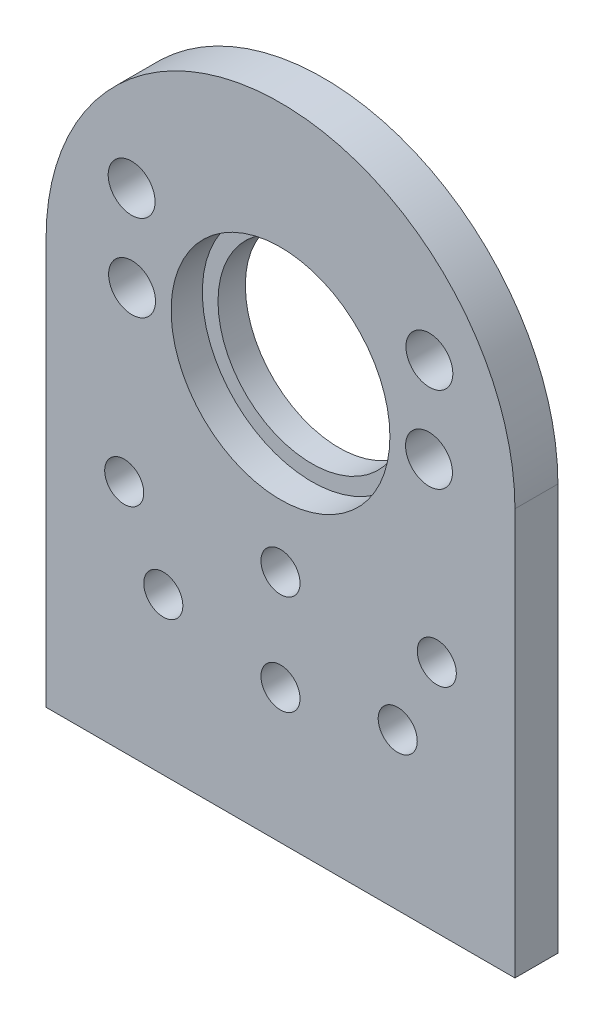
ISO-10303-21;
HEADER;
FILE_DESCRIPTION(('STEP AP214'),'2;1');
FILE_NAME('part.step','',(''),(''),'','','');
FILE_SCHEMA(('AUTOMOTIVE_DESIGN { 1 0 10303 214 1 1 1 1 }'));
ENDSEC;
DATA;
#1=APPLICATION_CONTEXT('core data for automotive mechanical design processes');
#2=APPLICATION_PROTOCOL_DEFINITION('international standard','automotive_design',2000,#1);
#3=PRODUCT_CONTEXT('',#1,'mechanical');
#4=PRODUCT('Part','Part','',(#3));
#5=PRODUCT_RELATED_PRODUCT_CATEGORY('part','',(#4));
#6=PRODUCT_DEFINITION_FORMATION('','',#4);
#7=PRODUCT_DEFINITION_CONTEXT('part definition',#1,'design');
#8=PRODUCT_DEFINITION('design','',#6,#7);
#9=PRODUCT_DEFINITION_SHAPE('','',#8);
#10=(LENGTH_UNIT() NAMED_UNIT(*) SI_UNIT(.MILLI.,.METRE.));
#11=(NAMED_UNIT(*) PLANE_ANGLE_UNIT() SI_UNIT($,.RADIAN.));
#12=(NAMED_UNIT(*) SI_UNIT($,.STERADIAN.) SOLID_ANGLE_UNIT());
#13=UNCERTAINTY_MEASURE_WITH_UNIT(LENGTH_MEASURE(1.E-05),#10,'distance_accuracy_value','');
#14=(GEOMETRIC_REPRESENTATION_CONTEXT(3) GLOBAL_UNCERTAINTY_ASSIGNED_CONTEXT((#13)) GLOBAL_UNIT_ASSIGNED_CONTEXT((#10,
#11,#12)) REPRESENTATION_CONTEXT('',''));
#15=CARTESIAN_POINT('',(0.,0.,0.));
#16=DIRECTION('',(0.,0.,1.));
#17=DIRECTION('',(1.,0.,0.));
#18=AXIS2_PLACEMENT_3D('',#15,#16,#17);
#19=CARTESIAN_POINT('',(4.89347707421227E-07,13.,3.75));
#20=DIRECTION('',(0.,0.,-1.));
#21=DIRECTION('',(-1.,0.,0.));
#22=AXIS2_PLACEMENT_3D('',#19,#20,#21);
#23=CYLINDRICAL_SURFACE('',#22,6.);
#24=CARTESIAN_POINT('',(4.89347707421227E-07,13.,0.));
#25=DIRECTION('',(0.,0.,1.));
#26=DIRECTION('',(1.,0.,0.));
#27=AXIS2_PLACEMENT_3D('',#24,#25,#26);
#28=CIRCLE('',#27,6.);
#29=CARTESIAN_POINT('',(6.00000048934771,13.,0.));
#30=VERTEX_POINT('',#29);
#31=EDGE_CURVE('E206',#30,#30,#28,.T.);
#32=ORIENTED_EDGE('',*,*,#31,.F.);
#33=EDGE_LOOP('',(#32));
#34=FACE_BOUND('',#33,.T.);
#35=CARTESIAN_POINT('',(4.89347707421227E-07,13.,1.75));
#36=DIRECTION('',(0.,0.,1.));
#37=DIRECTION('',(1.,0.,0.));
#38=AXIS2_PLACEMENT_3D('',#35,#36,#37);
#39=CIRCLE('',#38,6.);
#40=CARTESIAN_POINT('',(6.00000048934771,13.,1.75));
#41=VERTEX_POINT('',#40);
#42=EDGE_CURVE('E157',#41,#41,#39,.T.);
#43=ORIENTED_EDGE('',*,*,#42,.T.);
#44=EDGE_LOOP('',(#43));
#45=FACE_BOUND('',#44,.T.);
#46=ADVANCED_FACE('F36',(#34,#45),#23,.F.);
#47=CARTESIAN_POINT('',(4.89347707421227E-07,13.,3.75));
#48=DIRECTION('',(0.,0.,1.));
#49=DIRECTION('',(1.,0.,0.));
#50=AXIS2_PLACEMENT_3D('',#47,#48,#49);
#51=PLANE('',#50);
#52=CARTESIAN_POINT('',(-9.52627895228111,18.5,3.75));
#53=DIRECTION('',(0.,0.,1.));
#54=DIRECTION('',(1.,0.,0.));
#55=AXIS2_PLACEMENT_3D('',#52,#53,#54);
#56=CIRCLE('',#55,1.5);
#57=CARTESIAN_POINT('',(-8.02627895228111,18.5,3.75));
#58=VERTEX_POINT('',#57);
#59=EDGE_CURVE('E231',#58,#58,#56,.T.);
#60=ORIENTED_EDGE('',*,*,#59,.F.);
#61=EDGE_LOOP('',(#60));
#62=FACE_BOUND('',#61,.T.);
#63=CARTESIAN_POINT('',(9.52628034503994,18.4999992828211,3.75));
#64=DIRECTION('',(0.,0.,1.));
#65=DIRECTION('',(-1.,0.,0.));
#66=AXIS2_PLACEMENT_3D('',#63,#64,#65);
#67=CIRCLE('',#66,1.5);
#68=CARTESIAN_POINT('',(8.02628034503994,18.4999992828211,3.75));
#69=VERTEX_POINT('',#68);
#70=EDGE_CURVE('E236',#69,#69,#67,.T.);
#71=ORIENTED_EDGE('',*,*,#70,.F.);
#72=EDGE_LOOP('',(#71));
#73=FACE_BOUND('',#72,.T.);
#74=CARTESIAN_POINT('',(4.89347707421227E-07,13.,3.75));
#75=DIRECTION('',(0.,0.,1.));
#76=DIRECTION('',(1.,0.,0.));
#77=AXIS2_PLACEMENT_3D('',#74,#75,#76);
#78=CIRCLE('',#77,7.);
#79=CARTESIAN_POINT('',(7.00000048934771,13.,3.75));
#80=VERTEX_POINT('',#79);
#81=EDGE_CURVE('E153',#80,#80,#78,.T.);
#82=ORIENTED_EDGE('',*,*,#81,.F.);
#83=EDGE_LOOP('',(#82));
#84=FACE_BOUND('',#83,.T.);
#85=CARTESIAN_POINT('',(0.,2.,3.75));
#86=DIRECTION('',(0.,0.,1.));
#87=DIRECTION('',(1.,0.,0.));
#88=AXIS2_PLACEMENT_3D('',#85,#86,#87);
#89=CIRCLE('',#88,1.25);
#90=CARTESIAN_POINT('',(1.25,2.,3.75));
#91=VERTEX_POINT('',#90);
#92=EDGE_CURVE('E167',#91,#91,#89,.T.);
#93=ORIENTED_EDGE('',*,*,#92,.F.);
#94=EDGE_LOOP('',(#93));
#95=FACE_BOUND('',#94,.T.);
#96=CARTESIAN_POINT('',(10.0000004893477,2.,3.75));
#97=DIRECTION('',(0.,0.,1.));
#98=DIRECTION('',(1.,0.,0.));
#99=AXIS2_PLACEMENT_3D('',#96,#97,#98);
#100=CIRCLE('',#99,1.25);
#101=CARTESIAN_POINT('',(11.2500004893477,2.,3.75));
#102=VERTEX_POINT('',#101);
#103=EDGE_CURVE('E179',#102,#102,#100,.T.);
#104=ORIENTED_EDGE('',*,*,#103,.F.);
#105=EDGE_LOOP('',(#104));
#106=FACE_BOUND('',#105,.T.);
#107=CARTESIAN_POINT('',(7.5,-3.,3.75));
#108=DIRECTION('',(0.,0.,1.));
#109=DIRECTION('',(1.,0.,0.));
#110=AXIS2_PLACEMENT_3D('',#107,#108,#109);
#111=CIRCLE('',#110,1.25);
#112=CARTESIAN_POINT('',(8.75,-3.,3.75));
#113=VERTEX_POINT('',#112);
#114=EDGE_CURVE('E191',#113,#113,#111,.T.);
#115=ORIENTED_EDGE('',*,*,#114,.F.);
#116=EDGE_LOOP('',(#115));
#117=FACE_BOUND('',#116,.T.);
#118=CARTESIAN_POINT('',(-9.49999951065229,13.,3.75));
#119=DIRECTION('',(0.,0.,1.));
#120=DIRECTION('',(1.,0.,0.));
#121=AXIS2_PLACEMENT_3D('',#118,#119,#120);
#122=CIRCLE('',#121,1.5);
#123=CARTESIAN_POINT('',(-7.99999951065229,13.,3.75));
#124=VERTEX_POINT('',#123);
#125=EDGE_CURVE('E203',#124,#124,#122,.T.);
#126=ORIENTED_EDGE('',*,*,#125,.F.);
#127=EDGE_LOOP('',(#126));
#128=FACE_BOUND('',#127,.T.);
#129=DIRECTION('',(0.,1.,0.));
#130=VECTOR('',#129,1.);
#131=CARTESIAN_POINT('',(15.0000004893477,13.0000004241013,3.75));
#132=LINE('',#131,#130);
#133=CARTESIAN_POINT('',(15.0000004893477,-12.9999995758987,3.75));
#134=VERTEX_POINT('',#133);
#135=CARTESIAN_POINT('',(15.0000004893477,13.0000004241013,3.75));
#136=VERTEX_POINT('',#135);
#137=EDGE_CURVE('E211',#134,#136,#132,.T.);
#138=ORIENTED_EDGE('',*,*,#137,.T.);
#139=CARTESIAN_POINT('',(4.89347707421227E-07,13.,3.75));
#140=DIRECTION('',(0.,0.,1.));
#141=DIRECTION('',(1.,0.,0.));
#142=AXIS2_PLACEMENT_3D('',#139,#140,#141);
#143=CIRCLE('',#142,15.);
#144=CARTESIAN_POINT('',(-14.9999995106523,12.999998727696,3.75));
#145=VERTEX_POINT('',#144);
#146=EDGE_CURVE('E214',#136,#145,#143,.T.);
#147=ORIENTED_EDGE('',*,*,#146,.T.);
#148=DIRECTION('',(0.,-1.,0.));
#149=VECTOR('',#148,1.);
#150=CARTESIAN_POINT('',(-14.9999995106523,12.999998727696,3.75));
#151=LINE('',#150,#149);
#152=CARTESIAN_POINT('',(-14.9999995106523,-12.9999995758987,3.75));
#153=VERTEX_POINT('',#152);
#154=EDGE_CURVE('E216',#145,#153,#151,.T.);
#155=ORIENTED_EDGE('',*,*,#154,.T.);
#156=DIRECTION('',(1.,0.,0.));
#157=VECTOR('',#156,1.);
#158=CARTESIAN_POINT('',(-14.9999995106523,-12.9999995758987,3.75));
#159=LINE('',#158,#157);
#160=EDGE_CURVE('E218',#153,#134,#159,.T.);
#161=ORIENTED_EDGE('',*,*,#160,.T.);
#162=EDGE_LOOP('',(#138,#147,#155,#161));
#163=FACE_BOUND('',#162,.T.);
#164=CARTESIAN_POINT('',(9.50000048934771,13.,3.75));
#165=DIRECTION('',(0.,0.,1.));
#166=DIRECTION('',(1.,0.,0.));
#167=AXIS2_PLACEMENT_3D('',#164,#165,#166);
#168=CIRCLE('',#167,1.5);
#169=CARTESIAN_POINT('',(11.0000004893477,13.,3.75));
#170=VERTEX_POINT('',#169);
#171=EDGE_CURVE('E197',#170,#170,#168,.T.);
#172=ORIENTED_EDGE('',*,*,#171,.F.);
#173=EDGE_LOOP('',(#172));
#174=FACE_BOUND('',#173,.T.);
#175=CARTESIAN_POINT('',(-7.5,-3.,3.75));
#176=DIRECTION('',(0.,0.,1.));
#177=DIRECTION('',(1.,0.,0.));
#178=AXIS2_PLACEMENT_3D('',#175,#176,#177);
#179=CIRCLE('',#178,1.25);
#180=CARTESIAN_POINT('',(-6.25,-3.,3.75));
#181=VERTEX_POINT('',#180);
#182=EDGE_CURVE('E185',#181,#181,#179,.T.);
#183=ORIENTED_EDGE('',*,*,#182,.F.);
#184=EDGE_LOOP('',(#183));
#185=FACE_BOUND('',#184,.T.);
#186=CARTESIAN_POINT('',(-9.99999951065229,2.,3.75));
#187=DIRECTION('',(0.,0.,1.));
#188=DIRECTION('',(1.,0.,0.));
#189=AXIS2_PLACEMENT_3D('',#186,#187,#188);
#190=CIRCLE('',#189,1.25);
#191=CARTESIAN_POINT('',(-8.74999951065229,2.,3.75));
#192=VERTEX_POINT('',#191);
#193=EDGE_CURVE('E173',#192,#192,#190,.T.);
#194=ORIENTED_EDGE('',*,*,#193,.F.);
#195=EDGE_LOOP('',(#194));
#196=FACE_BOUND('',#195,.T.);
#197=CARTESIAN_POINT('',(0.,-4.4,3.75));
#198=DIRECTION('',(0.,0.,1.));
#199=DIRECTION('',(1.,0.,0.));
#200=AXIS2_PLACEMENT_3D('',#197,#198,#199);
#201=CIRCLE('',#200,1.25);
#202=CARTESIAN_POINT('',(1.24999999999999,-4.4,3.75));
#203=VERTEX_POINT('',#202);
#204=EDGE_CURVE('E160',#203,#203,#201,.T.);
#205=ORIENTED_EDGE('',*,*,#204,.F.);
#206=EDGE_LOOP('',(#205));
#207=FACE_BOUND('',#206,.T.);
#208=ADVANCED_FACE('F246',(#62,#73,#84,#95,#106,#117,#128,#163,#174,#185,#196,#207),#51,.T.);
#209=CARTESIAN_POINT('',(4.89347707421227E-07,13.,0.));
#210=DIRECTION('',(0.,0.,1.));
#211=DIRECTION('',(1.,0.,0.));
#212=AXIS2_PLACEMENT_3D('',#209,#210,#211);
#213=PLANE('',#212);
#214=CARTESIAN_POINT('',(-9.52627895228111,18.5,0.));
#215=DIRECTION('',(0.,0.,1.));
#216=DIRECTION('',(1.,0.,0.));
#217=AXIS2_PLACEMENT_3D('',#214,#215,#216);
#218=CIRCLE('',#217,1.5);
#219=CARTESIAN_POINT('',(-8.02627895228111,18.5,0.));
#220=VERTEX_POINT('',#219);
#221=EDGE_CURVE('E40',#220,#220,#218,.T.);
#222=ORIENTED_EDGE('',*,*,#221,.T.);
#223=EDGE_LOOP('',(#222));
#224=FACE_BOUND('',#223,.T.);
#225=CARTESIAN_POINT('',(9.52628034503994,18.4999992828211,0.));
#226=DIRECTION('',(0.,0.,1.));
#227=DIRECTION('',(1.,0.,0.));
#228=AXIS2_PLACEMENT_3D('',#225,#226,#227);
#229=CIRCLE('',#228,1.5);
#230=CARTESIAN_POINT('',(11.0262803450399,18.4999992828211,0.));
#231=VERTEX_POINT('',#230);
#232=EDGE_CURVE('E229',#231,#231,#229,.T.);
#233=ORIENTED_EDGE('',*,*,#232,.T.);
#234=EDGE_LOOP('',(#233));
#235=FACE_BOUND('',#234,.T.);
#236=DIRECTION('',(0.,-1.,0.));
#237=VECTOR('',#236,1.);
#238=CARTESIAN_POINT('',(-13.4999995106523,12.9999988549264,0.));
#239=LINE('',#238,#237);
#240=CARTESIAN_POINT('',(-13.4999995106523,12.9999988549264,0.));
#241=VERTEX_POINT('',#240);
#242=CARTESIAN_POINT('',(-13.4999995106523,-11.4999995758987,0.));
#243=VERTEX_POINT('',#242);
#244=EDGE_CURVE('E136',#241,#243,#239,.T.);
#245=ORIENTED_EDGE('',*,*,#244,.F.);
#246=CARTESIAN_POINT('',(4.89347707421227E-07,13.,0.));
#247=DIRECTION('',(0.,0.,1.));
#248=DIRECTION('',(1.,0.,0.));
#249=AXIS2_PLACEMENT_3D('',#246,#247,#248);
#250=CIRCLE('',#249,13.5);
#251=CARTESIAN_POINT('',(13.5000004893477,13.0000003816912,0.));
#252=VERTEX_POINT('',#251);
#253=EDGE_CURVE('E119',#252,#241,#250,.T.);
#254=ORIENTED_EDGE('',*,*,#253,.F.);
#255=DIRECTION('',(0.,1.,0.));
#256=VECTOR('',#255,1.);
#257=CARTESIAN_POINT('',(13.5000004893477,-11.4999995758987,0.));
#258=LINE('',#257,#256);
#259=CARTESIAN_POINT('',(13.5000004893477,-11.4999995758986,0.));
#260=VERTEX_POINT('',#259);
#261=EDGE_CURVE('E113',#260,#252,#258,.T.);
#262=ORIENTED_EDGE('',*,*,#261,.F.);
#263=DIRECTION('',(1.,0.,0.));
#264=VECTOR('',#263,1.);
#265=CARTESIAN_POINT('',(-13.4999995106523,-11.4999995758987,0.));
#266=LINE('',#265,#264);
#267=EDGE_CURVE('E53',#243,#260,#266,.T.);
#268=ORIENTED_EDGE('',*,*,#267,.F.);
#269=EDGE_LOOP('',(#245,#254,#262,#268));
#270=FACE_BOUND('',#269,.T.);
#271=ORIENTED_EDGE('',*,*,#31,.T.);
#272=EDGE_LOOP('',(#271));
#273=FACE_BOUND('',#272,.T.);
#274=CARTESIAN_POINT('',(-9.49999951065229,13.,0.));
#275=DIRECTION('',(0.,0.,1.));
#276=DIRECTION('',(1.,0.,0.));
#277=AXIS2_PLACEMENT_3D('',#274,#275,#276);
#278=CIRCLE('',#277,1.5);
#279=CARTESIAN_POINT('',(-7.99999951065229,13.,0.));
#280=VERTEX_POINT('',#279);
#281=EDGE_CURVE('E200',#280,#280,#278,.T.);
#282=ORIENTED_EDGE('',*,*,#281,.T.);
#283=EDGE_LOOP('',(#282));
#284=FACE_BOUND('',#283,.T.);
#285=CARTESIAN_POINT('',(9.50000048934771,13.,0.));
#286=DIRECTION('',(0.,0.,1.));
#287=DIRECTION('',(1.,0.,0.));
#288=AXIS2_PLACEMENT_3D('',#285,#286,#287);
#289=CIRCLE('',#288,1.5);
#290=CARTESIAN_POINT('',(11.0000004893477,13.,0.));
#291=VERTEX_POINT('',#290);
#292=EDGE_CURVE('E194',#291,#291,#289,.T.);
#293=ORIENTED_EDGE('',*,*,#292,.T.);
#294=EDGE_LOOP('',(#293));
#295=FACE_BOUND('',#294,.T.);
#296=CARTESIAN_POINT('',(7.5,-3.,0.));
#297=DIRECTION('',(0.,0.,1.));
#298=DIRECTION('',(1.,0.,0.));
#299=AXIS2_PLACEMENT_3D('',#296,#297,#298);
#300=CIRCLE('',#299,1.25);
#301=CARTESIAN_POINT('',(8.75,-3.,0.));
#302=VERTEX_POINT('',#301);
#303=EDGE_CURVE('E188',#302,#302,#300,.T.);
#304=ORIENTED_EDGE('',*,*,#303,.T.);
#305=EDGE_LOOP('',(#304));
#306=FACE_BOUND('',#305,.T.);
#307=CARTESIAN_POINT('',(-7.5,-3.,0.));
#308=DIRECTION('',(0.,0.,1.));
#309=DIRECTION('',(1.,0.,0.));
#310=AXIS2_PLACEMENT_3D('',#307,#308,#309);
#311=CIRCLE('',#310,1.25);
#312=CARTESIAN_POINT('',(-6.25,-3.,0.));
#313=VERTEX_POINT('',#312);
#314=EDGE_CURVE('E182',#313,#313,#311,.T.);
#315=ORIENTED_EDGE('',*,*,#314,.T.);
#316=EDGE_LOOP('',(#315));
#317=FACE_BOUND('',#316,.T.);
#318=CARTESIAN_POINT('',(10.0000004893477,2.,0.));
#319=DIRECTION('',(0.,0.,1.));
#320=DIRECTION('',(1.,0.,0.));
#321=AXIS2_PLACEMENT_3D('',#318,#319,#320);
#322=CIRCLE('',#321,1.25);
#323=CARTESIAN_POINT('',(11.2500004893477,2.,0.));
#324=VERTEX_POINT('',#323);
#325=EDGE_CURVE('E176',#324,#324,#322,.T.);
#326=ORIENTED_EDGE('',*,*,#325,.T.);
#327=EDGE_LOOP('',(#326));
#328=FACE_BOUND('',#327,.T.);
#329=CARTESIAN_POINT('',(-9.99999951065229,2.,0.));
#330=DIRECTION('',(0.,0.,1.));
#331=DIRECTION('',(1.,0.,0.));
#332=AXIS2_PLACEMENT_3D('',#329,#330,#331);
#333=CIRCLE('',#332,1.25);
#334=CARTESIAN_POINT('',(-8.74999951065229,2.,0.));
#335=VERTEX_POINT('',#334);
#336=EDGE_CURVE('E170',#335,#335,#333,.T.);
#337=ORIENTED_EDGE('',*,*,#336,.T.);
#338=EDGE_LOOP('',(#337));
#339=FACE_BOUND('',#338,.T.);
#340=CARTESIAN_POINT('',(0.,2.,0.));
#341=DIRECTION('',(0.,0.,1.));
#342=DIRECTION('',(1.,0.,0.));
#343=AXIS2_PLACEMENT_3D('',#340,#341,#342);
#344=CIRCLE('',#343,1.25);
#345=CARTESIAN_POINT('',(1.25,2.,0.));
#346=VERTEX_POINT('',#345);
#347=EDGE_CURVE('E163',#346,#346,#344,.T.);
#348=ORIENTED_EDGE('',*,*,#347,.T.);
#349=EDGE_LOOP('',(#348));
#350=FACE_BOUND('',#349,.T.);
#351=CARTESIAN_POINT('',(0.,-4.4,0.));
#352=DIRECTION('',(0.,0.,1.));
#353=DIRECTION('',(1.,0.,0.));
#354=AXIS2_PLACEMENT_3D('',#351,#352,#353);
#355=CIRCLE('',#354,1.25);
#356=CARTESIAN_POINT('',(1.24999999999999,-4.4,0.));
#357=VERTEX_POINT('',#356);
#358=EDGE_CURVE('E164',#357,#357,#355,.T.);
#359=ORIENTED_EDGE('',*,*,#358,.T.);
#360=EDGE_LOOP('',(#359));
#361=FACE_BOUND('',#360,.T.);
#362=ADVANCED_FACE('F249',(#224,#235,#270,#273,#284,#295,#306,#317,#328,#339,#350,#361),#213,.F.);
#363=CARTESIAN_POINT('',(15.0000004893477,13.0000004241013,3.75));
#364=DIRECTION('',(-1.,0.,0.));
#365=DIRECTION('',(0.,-1.,0.));
#366=AXIS2_PLACEMENT_3D('',#363,#364,#365);
#367=PLANE('',#366);
#368=DIRECTION('',(0.,0.,-1.));
#369=VECTOR('',#368,1.);
#370=CARTESIAN_POINT('',(15.0000004893477,-12.9999995758987,3.75));
#371=LINE('',#370,#369);
#372=CARTESIAN_POINT('',(15.0000004893477,-12.9999995758987,1.));
#373=VERTEX_POINT('',#372);
#374=EDGE_CURVE('E220',#134,#373,#371,.T.);
#375=ORIENTED_EDGE('',*,*,#374,.T.);
#376=DIRECTION('',(0.,1.,0.));
#377=VECTOR('',#376,1.);
#378=CARTESIAN_POINT('',(15.0000004893477,-12.9999995758987,1.));
#379=LINE('',#378,#377);
#380=CARTESIAN_POINT('',(15.0000004893477,13.0000004241013,1.));
#381=VERTEX_POINT('',#380);
#382=EDGE_CURVE('E61',#373,#381,#379,.T.);
#383=ORIENTED_EDGE('',*,*,#382,.T.);
#384=DIRECTION('',(0.,0.,-1.));
#385=VECTOR('',#384,1.);
#386=CARTESIAN_POINT('',(15.0000004893477,13.0000004241013,3.75));
#387=LINE('',#386,#385);
#388=EDGE_CURVE('E11',#136,#381,#387,.T.);
#389=ORIENTED_EDGE('',*,*,#388,.F.);
#390=ORIENTED_EDGE('',*,*,#137,.F.);
#391=EDGE_LOOP('',(#375,#383,#389,#390));
#392=FACE_BOUND('',#391,.T.);
#393=ADVANCED_FACE('F38',(#392),#367,.F.);
#394=CARTESIAN_POINT('',(4.89347707421227E-07,13.,3.75));
#395=DIRECTION('',(0.,0.,-1.));
#396=DIRECTION('',(-1.,0.,0.));
#397=AXIS2_PLACEMENT_3D('',#394,#395,#396);
#398=CYLINDRICAL_SURFACE('',#397,15.);
#399=ORIENTED_EDGE('',*,*,#388,.T.);
#400=CARTESIAN_POINT('',(4.89347707421227E-07,13.,1.));
#401=DIRECTION('',(0.,0.,1.));
#402=DIRECTION('',(1.,0.,0.));
#403=AXIS2_PLACEMENT_3D('',#400,#401,#402);
#404=CIRCLE('',#403,15.);
#405=CARTESIAN_POINT('',(-14.9999995106523,12.999998727696,1.));
#406=VERTEX_POINT('',#405);
#407=EDGE_CURVE('E147',#381,#406,#404,.T.);
#408=ORIENTED_EDGE('',*,*,#407,.T.);
#409=DIRECTION('',(0.,0.,-1.));
#410=VECTOR('',#409,1.);
#411=CARTESIAN_POINT('',(-14.9999995106523,12.999998727696,3.75));
#412=LINE('',#411,#410);
#413=EDGE_CURVE('E45',#145,#406,#412,.T.);
#414=ORIENTED_EDGE('',*,*,#413,.F.);
#415=ORIENTED_EDGE('',*,*,#146,.F.);
#416=EDGE_LOOP('',(#399,#408,#414,#415));
#417=FACE_BOUND('',#416,.T.);
#418=ADVANCED_FACE('F288',(#417),#398,.T.);
#419=CARTESIAN_POINT('',(-14.9999995106523,12.999998727696,3.75));
#420=DIRECTION('',(1.,0.,0.));
#421=DIRECTION('',(0.,0.,-1.));
#422=AXIS2_PLACEMENT_3D('',#419,#420,#421);
#423=PLANE('',#422);
#424=ORIENTED_EDGE('',*,*,#413,.T.);
#425=DIRECTION('',(0.,-1.,0.));
#426=VECTOR('',#425,1.);
#427=CARTESIAN_POINT('',(-14.9999995106523,12.999998727696,1.));
#428=LINE('',#427,#426);
#429=CARTESIAN_POINT('',(-14.9999995106523,-12.9999995758987,1.));
#430=VERTEX_POINT('',#429);
#431=EDGE_CURVE('E150',#406,#430,#428,.T.);
#432=ORIENTED_EDGE('',*,*,#431,.T.);
#433=DIRECTION('',(0.,0.,-1.));
#434=VECTOR('',#433,1.);
#435=CARTESIAN_POINT('',(-14.9999995106523,-12.9999995758987,3.75));
#436=LINE('',#435,#434);
#437=EDGE_CURVE('E223',#153,#430,#436,.T.);
#438=ORIENTED_EDGE('',*,*,#437,.F.);
#439=ORIENTED_EDGE('',*,*,#154,.F.);
#440=EDGE_LOOP('',(#424,#432,#438,#439));
#441=FACE_BOUND('',#440,.T.);
#442=ADVANCED_FACE('F426',(#441),#423,.F.);
#443=CARTESIAN_POINT('',(-14.9999995106523,-12.9999995758987,3.75));
#444=DIRECTION('',(0.,1.,0.));
#445=DIRECTION('',(0.,0.,1.));
#446=AXIS2_PLACEMENT_3D('',#443,#444,#445);
#447=PLANE('',#446);
#448=ORIENTED_EDGE('',*,*,#437,.T.);
#449=DIRECTION('',(1.,0.,0.));
#450=VECTOR('',#449,1.);
#451=CARTESIAN_POINT('',(-14.9999995106523,-12.9999995758987,1.));
#452=LINE('',#451,#450);
#453=EDGE_CURVE('E123',#430,#373,#452,.T.);
#454=ORIENTED_EDGE('',*,*,#453,.T.);
#455=ORIENTED_EDGE('',*,*,#374,.F.);
#456=ORIENTED_EDGE('',*,*,#160,.F.);
#457=EDGE_LOOP('',(#448,#454,#455,#456));
#458=FACE_BOUND('',#457,.T.);
#459=ADVANCED_FACE('F304',(#458),#447,.F.);
#460=CARTESIAN_POINT('',(-9.49999951065229,13.,3.75));
#461=DIRECTION('',(0.,0.,-1.));
#462=DIRECTION('',(-1.,0.,0.));
#463=AXIS2_PLACEMENT_3D('',#460,#461,#462);
#464=CYLINDRICAL_SURFACE('',#463,1.5);
#465=ORIENTED_EDGE('',*,*,#125,.T.);
#466=EDGE_LOOP('',(#465));
#467=FACE_BOUND('',#466,.T.);
#468=ORIENTED_EDGE('',*,*,#281,.F.);
#469=EDGE_LOOP('',(#468));
#470=FACE_BOUND('',#469,.T.);
#471=ADVANCED_FACE('F300',(#467,#470),#464,.F.);
#472=CARTESIAN_POINT('',(9.50000048934771,13.,3.75));
#473=DIRECTION('',(0.,0.,-1.));
#474=DIRECTION('',(-1.,0.,0.));
#475=AXIS2_PLACEMENT_3D('',#472,#473,#474);
#476=CYLINDRICAL_SURFACE('',#475,1.5);
#477=ORIENTED_EDGE('',*,*,#171,.T.);
#478=EDGE_LOOP('',(#477));
#479=FACE_BOUND('',#478,.T.);
#480=ORIENTED_EDGE('',*,*,#292,.F.);
#481=EDGE_LOOP('',(#480));
#482=FACE_BOUND('',#481,.T.);
#483=ADVANCED_FACE('F303',(#479,#482),#476,.F.);
#484=CARTESIAN_POINT('',(7.5,-3.,3.75));
#485=DIRECTION('',(0.,0.,-1.));
#486=DIRECTION('',(-1.,0.,0.));
#487=AXIS2_PLACEMENT_3D('',#484,#485,#486);
#488=CYLINDRICAL_SURFACE('',#487,1.25);
#489=ORIENTED_EDGE('',*,*,#114,.T.);
#490=EDGE_LOOP('',(#489));
#491=FACE_BOUND('',#490,.T.);
#492=ORIENTED_EDGE('',*,*,#303,.F.);
#493=EDGE_LOOP('',(#492));
#494=FACE_BOUND('',#493,.T.);
#495=ADVANCED_FACE('F308',(#491,#494),#488,.F.);
#496=CARTESIAN_POINT('',(-7.5,-3.,3.75));
#497=DIRECTION('',(0.,0.,-1.));
#498=DIRECTION('',(-1.,0.,0.));
#499=AXIS2_PLACEMENT_3D('',#496,#497,#498);
#500=CYLINDRICAL_SURFACE('',#499,1.25);
#501=ORIENTED_EDGE('',*,*,#182,.T.);
#502=EDGE_LOOP('',(#501));
#503=FACE_BOUND('',#502,.T.);
#504=ORIENTED_EDGE('',*,*,#314,.F.);
#505=EDGE_LOOP('',(#504));
#506=FACE_BOUND('',#505,.T.);
#507=ADVANCED_FACE('F312',(#503,#506),#500,.F.);
#508=CARTESIAN_POINT('',(10.0000004893477,2.,3.75));
#509=DIRECTION('',(0.,0.,-1.));
#510=DIRECTION('',(-1.,0.,0.));
#511=AXIS2_PLACEMENT_3D('',#508,#509,#510);
#512=CYLINDRICAL_SURFACE('',#511,1.25);
#513=ORIENTED_EDGE('',*,*,#103,.T.);
#514=EDGE_LOOP('',(#513));
#515=FACE_BOUND('',#514,.T.);
#516=ORIENTED_EDGE('',*,*,#325,.F.);
#517=EDGE_LOOP('',(#516));
#518=FACE_BOUND('',#517,.T.);
#519=ADVANCED_FACE('F316',(#515,#518),#512,.F.);
#520=CARTESIAN_POINT('',(-9.99999951065229,2.,3.75));
#521=DIRECTION('',(0.,0.,-1.));
#522=DIRECTION('',(-1.,0.,0.));
#523=AXIS2_PLACEMENT_3D('',#520,#521,#522);
#524=CYLINDRICAL_SURFACE('',#523,1.25);
#525=ORIENTED_EDGE('',*,*,#193,.T.);
#526=EDGE_LOOP('',(#525));
#527=FACE_BOUND('',#526,.T.);
#528=ORIENTED_EDGE('',*,*,#336,.F.);
#529=EDGE_LOOP('',(#528));
#530=FACE_BOUND('',#529,.T.);
#531=ADVANCED_FACE('F320',(#527,#530),#524,.F.);
#532=CARTESIAN_POINT('',(0.,2.,3.75));
#533=DIRECTION('',(0.,0.,-1.));
#534=DIRECTION('',(-1.,0.,0.));
#535=AXIS2_PLACEMENT_3D('',#532,#533,#534);
#536=CYLINDRICAL_SURFACE('',#535,1.25);
#537=ORIENTED_EDGE('',*,*,#92,.T.);
#538=EDGE_LOOP('',(#537));
#539=FACE_BOUND('',#538,.T.);
#540=ORIENTED_EDGE('',*,*,#347,.F.);
#541=EDGE_LOOP('',(#540));
#542=FACE_BOUND('',#541,.T.);
#543=ADVANCED_FACE('F277',(#539,#542),#536,.F.);
#544=CARTESIAN_POINT('',(0.,-4.4,3.75));
#545=DIRECTION('',(0.,0.,-1.));
#546=DIRECTION('',(-1.,0.,0.));
#547=AXIS2_PLACEMENT_3D('',#544,#545,#546);
#548=CYLINDRICAL_SURFACE('',#547,1.25);
#549=ORIENTED_EDGE('',*,*,#204,.T.);
#550=EDGE_LOOP('',(#549));
#551=FACE_BOUND('',#550,.T.);
#552=ORIENTED_EDGE('',*,*,#358,.F.);
#553=EDGE_LOOP('',(#552));
#554=FACE_BOUND('',#553,.T.);
#555=ADVANCED_FACE('F273',(#551,#554),#548,.F.);
#556=CARTESIAN_POINT('',(4.89347707421227E-07,13.,1.75));
#557=DIRECTION('',(0.,0.,1.));
#558=DIRECTION('',(1.,0.,0.));
#559=AXIS2_PLACEMENT_3D('',#556,#557,#558);
#560=CYLINDRICAL_SURFACE('',#559,7.);
#561=CARTESIAN_POINT('',(4.89347707421227E-07,13.,1.75));
#562=DIRECTION('',(0.,0.,1.));
#563=DIRECTION('',(1.,0.,0.));
#564=AXIS2_PLACEMENT_3D('',#561,#562,#563);
#565=CIRCLE('',#564,7.);
#566=CARTESIAN_POINT('',(7.00000048934771,13.,1.75));
#567=VERTEX_POINT('',#566);
#568=EDGE_CURVE('E154',#567,#567,#565,.T.);
#569=ORIENTED_EDGE('',*,*,#568,.F.);
#570=EDGE_LOOP('',(#569));
#571=FACE_BOUND('',#570,.T.);
#572=ORIENTED_EDGE('',*,*,#81,.T.);
#573=EDGE_LOOP('',(#572));
#574=FACE_BOUND('',#573,.T.);
#575=ADVANCED_FACE('F276',(#571,#574),#560,.F.);
#576=CARTESIAN_POINT('',(4.89347707421227E-07,13.,1.75));
#577=DIRECTION('',(0.,0.,1.));
#578=DIRECTION('',(1.,0.,0.));
#579=AXIS2_PLACEMENT_3D('',#576,#577,#578);
#580=PLANE('',#579);
#581=ORIENTED_EDGE('',*,*,#42,.F.);
#582=EDGE_LOOP('',(#581));
#583=FACE_BOUND('',#582,.T.);
#584=ORIENTED_EDGE('',*,*,#568,.T.);
#585=EDGE_LOOP('',(#584));
#586=FACE_BOUND('',#585,.T.);
#587=ADVANCED_FACE('F330',(#583,#586),#580,.T.);
#588=CARTESIAN_POINT('',(4.89347707421227E-07,13.,1.));
#589=DIRECTION('',(0.,0.,1.));
#590=DIRECTION('',(1.,0.,0.));
#591=AXIS2_PLACEMENT_3D('',#588,#589,#590);
#592=PLANE('',#591);
#593=ORIENTED_EDGE('',*,*,#453,.F.);
#594=ORIENTED_EDGE('',*,*,#431,.F.);
#595=ORIENTED_EDGE('',*,*,#407,.F.);
#596=ORIENTED_EDGE('',*,*,#382,.F.);
#597=EDGE_LOOP('',(#593,#594,#595,#596));
#598=FACE_BOUND('',#597,.T.);
#599=DIRECTION('',(0.,-1.,0.));
#600=VECTOR('',#599,1.);
#601=CARTESIAN_POINT('',(-13.4999995106523,12.9999988549264,1.));
#602=LINE('',#601,#600);
#603=CARTESIAN_POINT('',(-13.4999995106523,12.9999988549264,1.));
#604=VERTEX_POINT('',#603);
#605=CARTESIAN_POINT('',(-13.4999995106523,-11.4999995758987,1.));
#606=VERTEX_POINT('',#605);
#607=EDGE_CURVE('E107',#604,#606,#602,.T.);
#608=ORIENTED_EDGE('',*,*,#607,.T.);
#609=DIRECTION('',(1.,0.,0.));
#610=VECTOR('',#609,1.);
#611=CARTESIAN_POINT('',(-13.4999995106523,-11.4999995758987,1.));
#612=LINE('',#611,#610);
#613=CARTESIAN_POINT('',(13.5000004893477,-11.4999995758986,1.));
#614=VERTEX_POINT('',#613);
#615=EDGE_CURVE('E128',#606,#614,#612,.T.);
#616=ORIENTED_EDGE('',*,*,#615,.T.);
#617=DIRECTION('',(0.,1.,0.));
#618=VECTOR('',#617,1.);
#619=CARTESIAN_POINT('',(13.5000004893477,-11.4999995758987,1.));
#620=LINE('',#619,#618);
#621=CARTESIAN_POINT('',(13.5000004893477,13.0000003816912,1.));
#622=VERTEX_POINT('',#621);
#623=EDGE_CURVE('E110',#614,#622,#620,.T.);
#624=ORIENTED_EDGE('',*,*,#623,.T.);
#625=CARTESIAN_POINT('',(4.89347707421227E-07,13.,1.));
#626=DIRECTION('',(0.,0.,1.));
#627=DIRECTION('',(1.,0.,0.));
#628=AXIS2_PLACEMENT_3D('',#625,#626,#627);
#629=CIRCLE('',#628,13.5);
#630=EDGE_CURVE('E102',#622,#604,#629,.T.);
#631=ORIENTED_EDGE('',*,*,#630,.T.);
#632=EDGE_LOOP('',(#608,#616,#624,#631));
#633=FACE_BOUND('',#632,.T.);
#634=ADVANCED_FACE('F104',(#598,#633),#592,.F.);
#635=CARTESIAN_POINT('',(4.89347707421227E-07,13.,1.));
#636=DIRECTION('',(0.,0.,-1.));
#637=DIRECTION('',(-1.,0.,0.));
#638=AXIS2_PLACEMENT_3D('',#635,#636,#637);
#639=CYLINDRICAL_SURFACE('',#638,13.5);
#640=ORIENTED_EDGE('',*,*,#253,.T.);
#641=DIRECTION('',(0.,0.,-1.));
#642=VECTOR('',#641,1.);
#643=CARTESIAN_POINT('',(-13.4999995106523,12.9999988549264,1.));
#644=LINE('',#643,#642);
#645=EDGE_CURVE('E116',#604,#241,#644,.T.);
#646=ORIENTED_EDGE('',*,*,#645,.F.);
#647=ORIENTED_EDGE('',*,*,#630,.F.);
#648=DIRECTION('',(0.,0.,-1.));
#649=VECTOR('',#648,1.);
#650=CARTESIAN_POINT('',(13.5000004893477,13.0000003816912,1.));
#651=LINE('',#650,#649);
#652=EDGE_CURVE('E134',#622,#252,#651,.T.);
#653=ORIENTED_EDGE('',*,*,#652,.T.);
#654=EDGE_LOOP('',(#640,#646,#647,#653));
#655=FACE_BOUND('',#654,.T.);
#656=ADVANCED_FACE('F117',(#655),#639,.T.);
#657=CARTESIAN_POINT('',(-13.4999995106523,12.9999988549264,1.));
#658=DIRECTION('',(1.,0.,0.));
#659=DIRECTION('',(0.,1.,0.));
#660=AXIS2_PLACEMENT_3D('',#657,#658,#659);
#661=PLANE('',#660);
#662=ORIENTED_EDGE('',*,*,#244,.T.);
#663=DIRECTION('',(0.,0.,-1.));
#664=VECTOR('',#663,1.);
#665=CARTESIAN_POINT('',(-13.4999995106523,-11.4999995758987,1.));
#666=LINE('',#665,#664);
#667=EDGE_CURVE('E124',#606,#243,#666,.T.);
#668=ORIENTED_EDGE('',*,*,#667,.F.);
#669=ORIENTED_EDGE('',*,*,#607,.F.);
#670=ORIENTED_EDGE('',*,*,#645,.T.);
#671=EDGE_LOOP('',(#662,#668,#669,#670));
#672=FACE_BOUND('',#671,.T.);
#673=ADVANCED_FACE('F126',(#672),#661,.F.);
#674=CARTESIAN_POINT('',(-13.4999995106523,-11.4999995758987,1.));
#675=DIRECTION('',(0.,1.,0.));
#676=DIRECTION('',(0.,0.,1.));
#677=AXIS2_PLACEMENT_3D('',#674,#675,#676);
#678=PLANE('',#677);
#679=ORIENTED_EDGE('',*,*,#267,.T.);
#680=DIRECTION('',(0.,0.,-1.));
#681=VECTOR('',#680,1.);
#682=CARTESIAN_POINT('',(13.5000004893477,-11.4999995758987,1.));
#683=LINE('',#682,#681);
#684=EDGE_CURVE('E142',#614,#260,#683,.T.);
#685=ORIENTED_EDGE('',*,*,#684,.F.);
#686=ORIENTED_EDGE('',*,*,#615,.F.);
#687=ORIENTED_EDGE('',*,*,#667,.T.);
#688=EDGE_LOOP('',(#679,#685,#686,#687));
#689=FACE_BOUND('',#688,.T.);
#690=ADVANCED_FACE('F341',(#689),#678,.F.);
#691=CARTESIAN_POINT('',(13.5000004893477,-11.4999995758987,1.));
#692=DIRECTION('',(-1.,0.,0.));
#693=DIRECTION('',(0.,-1.,0.));
#694=AXIS2_PLACEMENT_3D('',#691,#692,#693);
#695=PLANE('',#694);
#696=ORIENTED_EDGE('',*,*,#261,.T.);
#697=ORIENTED_EDGE('',*,*,#652,.F.);
#698=ORIENTED_EDGE('',*,*,#623,.F.);
#699=ORIENTED_EDGE('',*,*,#684,.T.);
#700=EDGE_LOOP('',(#696,#697,#698,#699));
#701=FACE_BOUND('',#700,.T.);
#702=ADVANCED_FACE('F344',(#701),#695,.F.);
#703=CARTESIAN_POINT('',(9.52628034503994,18.4999992828211,-6.25));
#704=DIRECTION('',(0.,0.,1.));
#705=DIRECTION('',(1.,0.,0.));
#706=AXIS2_PLACEMENT_3D('',#703,#704,#705);
#707=CYLINDRICAL_SURFACE('',#706,1.5);
#708=ORIENTED_EDGE('',*,*,#70,.T.);
#709=EDGE_LOOP('',(#708));
#710=FACE_BOUND('',#709,.T.);
#711=ORIENTED_EDGE('',*,*,#232,.F.);
#712=EDGE_LOOP('',(#711));
#713=FACE_BOUND('',#712,.T.);
#714=ADVANCED_FACE('F243',(#710,#713),#707,.F.);
#715=CARTESIAN_POINT('',(-9.52627895228111,18.5,-6.25));
#716=DIRECTION('',(0.,0.,1.));
#717=DIRECTION('',(1.,0.,0.));
#718=AXIS2_PLACEMENT_3D('',#715,#716,#717);
#719=CYLINDRICAL_SURFACE('',#718,1.5);
#720=ORIENTED_EDGE('',*,*,#59,.T.);
#721=EDGE_LOOP('',(#720));
#722=FACE_BOUND('',#721,.T.);
#723=ORIENTED_EDGE('',*,*,#221,.F.);
#724=EDGE_LOOP('',(#723));
#725=FACE_BOUND('',#724,.T.);
#726=ADVANCED_FACE('F350',(#722,#725),#719,.F.);
#727=CLOSED_SHELL('',(#46,#208,#362,#393,#418,#442,#459,#471,#483,#495,#507,#519,#531,#543,#555,
#575,#587,#634,#656,#673,#690,#702,#714,#726));
#728=MANIFOLD_SOLID_BREP('B2',#727);
#729=ADVANCED_BREP_SHAPE_REPRESENTATION('',(#18,#728),#14);
#730=SHAPE_DEFINITION_REPRESENTATION(#9,#729);
ENDSEC;
END-ISO-10303-21;
